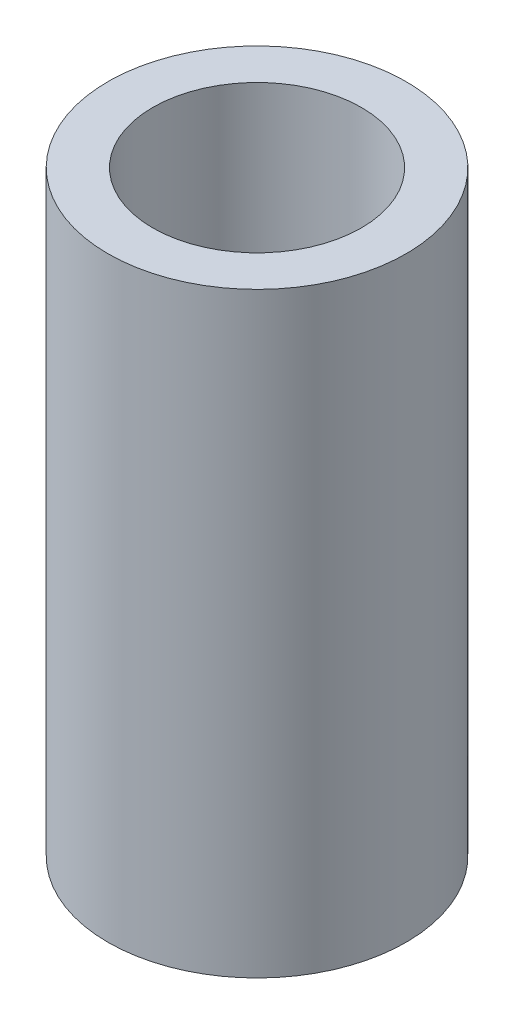
ISO-10303-21;
HEADER;
FILE_DESCRIPTION(('STEP AP214'),'2;1');
FILE_NAME('part.step','',(''),(''),'','','');
FILE_SCHEMA(('AUTOMOTIVE_DESIGN { 1 0 10303 214 1 1 1 1 }'));
ENDSEC;
DATA;
#1=APPLICATION_CONTEXT('core data for automotive mechanical design processes');
#2=APPLICATION_PROTOCOL_DEFINITION('international standard','automotive_design',2000,#1);
#3=PRODUCT_CONTEXT('',#1,'mechanical');
#4=PRODUCT('Part','Part','',(#3));
#5=PRODUCT_RELATED_PRODUCT_CATEGORY('part','',(#4));
#6=PRODUCT_DEFINITION_FORMATION('','',#4);
#7=PRODUCT_DEFINITION_CONTEXT('part definition',#1,'design');
#8=PRODUCT_DEFINITION('design','',#6,#7);
#9=PRODUCT_DEFINITION_SHAPE('','',#8);
#10=(LENGTH_UNIT() NAMED_UNIT(*) SI_UNIT(.MILLI.,.METRE.));
#11=(NAMED_UNIT(*) PLANE_ANGLE_UNIT() SI_UNIT($,.RADIAN.));
#12=(NAMED_UNIT(*) SI_UNIT($,.STERADIAN.) SOLID_ANGLE_UNIT());
#13=UNCERTAINTY_MEASURE_WITH_UNIT(LENGTH_MEASURE(1.E-05),#10,'distance_accuracy_value','');
#14=(GEOMETRIC_REPRESENTATION_CONTEXT(3) GLOBAL_UNCERTAINTY_ASSIGNED_CONTEXT((#13)) GLOBAL_UNIT_ASSIGNED_CONTEXT((#10,
#11,#12)) REPRESENTATION_CONTEXT('',''));
#15=CARTESIAN_POINT('',(0.,0.,0.));
#16=DIRECTION('',(0.,0.,1.));
#17=DIRECTION('',(1.,0.,0.));
#18=AXIS2_PLACEMENT_3D('',#15,#16,#17);
#19=CARTESIAN_POINT('',(0.,10.,0.));
#20=DIRECTION('',(0.,1.,0.));
#21=DIRECTION('',(0.,0.,1.));
#22=AXIS2_PLACEMENT_3D('',#19,#20,#21);
#23=PLANE('',#22);
#24=CARTESIAN_POINT('',(0.,10.,0.));
#25=DIRECTION('',(0.,1.,0.));
#26=DIRECTION('',(0.,0.,1.));
#27=AXIS2_PLACEMENT_3D('',#24,#25,#26);
#28=CIRCLE('',#27,2.5);
#29=CARTESIAN_POINT('',(0.,10.,2.5));
#30=VERTEX_POINT('',#29);
#31=EDGE_CURVE('E10',#30,#30,#28,.T.);
#32=ORIENTED_EDGE('',*,*,#31,.T.);
#33=EDGE_LOOP('',(#32));
#34=FACE_BOUND('',#33,.T.);
#35=CARTESIAN_POINT('',(0.,10.,0.));
#36=DIRECTION('',(0.,1.,0.));
#37=DIRECTION('',(0.,0.,1.));
#38=AXIS2_PLACEMENT_3D('',#35,#36,#37);
#39=CIRCLE('',#38,1.75);
#40=CARTESIAN_POINT('',(0.,10.,1.75));
#41=VERTEX_POINT('',#40);
#42=EDGE_CURVE('E41',#41,#41,#39,.T.);
#43=ORIENTED_EDGE('',*,*,#42,.F.);
#44=EDGE_LOOP('',(#43));
#45=FACE_BOUND('',#44,.T.);
#46=ADVANCED_FACE('F30',(#34,#45),#23,.T.);
#47=CARTESIAN_POINT('',(0.,0.,0.));
#48=DIRECTION('',(0.,1.,0.));
#49=DIRECTION('',(0.,0.,1.));
#50=AXIS2_PLACEMENT_3D('',#47,#48,#49);
#51=PLANE('',#50);
#52=CARTESIAN_POINT('',(0.,0.,0.));
#53=DIRECTION('',(0.,1.,0.));
#54=DIRECTION('',(0.,0.,1.));
#55=AXIS2_PLACEMENT_3D('',#52,#53,#54);
#56=CIRCLE('',#55,2.5);
#57=CARTESIAN_POINT('',(0.,0.,2.5));
#58=VERTEX_POINT('',#57);
#59=EDGE_CURVE('E34',#58,#58,#56,.T.);
#60=ORIENTED_EDGE('',*,*,#59,.F.);
#61=EDGE_LOOP('',(#60));
#62=FACE_BOUND('',#61,.T.);
#63=CARTESIAN_POINT('',(0.,0.,0.));
#64=DIRECTION('',(0.,1.,0.));
#65=DIRECTION('',(0.,0.,1.));
#66=AXIS2_PLACEMENT_3D('',#63,#64,#65);
#67=CIRCLE('',#66,1.75);
#68=CARTESIAN_POINT('',(0.,0.,1.75));
#69=VERTEX_POINT('',#68);
#70=EDGE_CURVE('E43',#69,#69,#67,.T.);
#71=ORIENTED_EDGE('',*,*,#70,.T.);
#72=EDGE_LOOP('',(#71));
#73=FACE_BOUND('',#72,.T.);
#74=ADVANCED_FACE('F53',(#62,#73),#51,.F.);
#75=CARTESIAN_POINT('',(0.,10.,0.));
#76=DIRECTION('',(0.,-1.,0.));
#77=DIRECTION('',(0.,0.,-1.));
#78=AXIS2_PLACEMENT_3D('',#75,#76,#77);
#79=CYLINDRICAL_SURFACE('',#78,2.5);
#80=ORIENTED_EDGE('',*,*,#31,.F.);
#81=EDGE_LOOP('',(#80));
#82=FACE_BOUND('',#81,.T.);
#83=ORIENTED_EDGE('',*,*,#59,.T.);
#84=EDGE_LOOP('',(#83));
#85=FACE_BOUND('',#84,.T.);
#86=ADVANCED_FACE('F32',(#82,#85),#79,.T.);
#87=CARTESIAN_POINT('',(0.,10.,0.));
#88=DIRECTION('',(0.,-1.,0.));
#89=DIRECTION('',(0.,0.,-1.));
#90=AXIS2_PLACEMENT_3D('',#87,#88,#89);
#91=CYLINDRICAL_SURFACE('',#90,1.75);
#92=ORIENTED_EDGE('',*,*,#42,.T.);
#93=EDGE_LOOP('',(#92));
#94=FACE_BOUND('',#93,.T.);
#95=ORIENTED_EDGE('',*,*,#70,.F.);
#96=EDGE_LOOP('',(#95));
#97=FACE_BOUND('',#96,.T.);
#98=ADVANCED_FACE('F49',(#94,#97),#91,.F.);
#99=CLOSED_SHELL('',(#46,#74,#86,#98));
#100=MANIFOLD_SOLID_BREP('B2',#99);
#101=ADVANCED_BREP_SHAPE_REPRESENTATION('',(#18,#100),#14);
#102=SHAPE_DEFINITION_REPRESENTATION(#9,#101);
ENDSEC;
END-ISO-10303-21;
